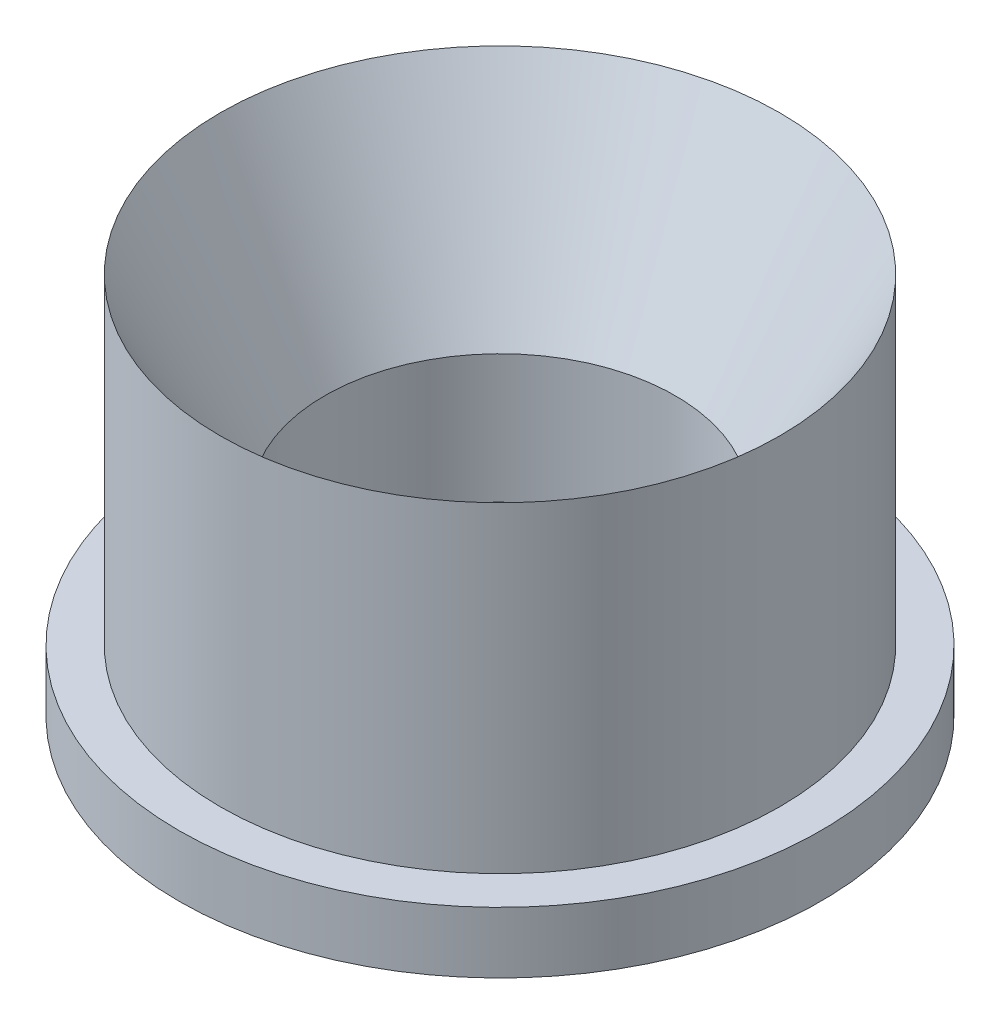
ISO-10303-21;
HEADER;
FILE_DESCRIPTION(('STEP AP214'),'2;1');
FILE_NAME('part.step','',(''),(''),'','','');
FILE_SCHEMA(('AUTOMOTIVE_DESIGN { 1 0 10303 214 1 1 1 1 }'));
ENDSEC;
DATA;
#1=APPLICATION_CONTEXT('core data for automotive mechanical design processes');
#2=APPLICATION_PROTOCOL_DEFINITION('international standard','automotive_design',2000,#1);
#3=PRODUCT_CONTEXT('',#1,'mechanical');
#4=PRODUCT('Part','Part','',(#3));
#5=PRODUCT_RELATED_PRODUCT_CATEGORY('part','',(#4));
#6=PRODUCT_DEFINITION_FORMATION('','',#4);
#7=PRODUCT_DEFINITION_CONTEXT('part definition',#1,'design');
#8=PRODUCT_DEFINITION('design','',#6,#7);
#9=PRODUCT_DEFINITION_SHAPE('','',#8);
#10=(LENGTH_UNIT() NAMED_UNIT(*) SI_UNIT(.MILLI.,.METRE.));
#11=(NAMED_UNIT(*) PLANE_ANGLE_UNIT() SI_UNIT($,.RADIAN.));
#12=(NAMED_UNIT(*) SI_UNIT($,.STERADIAN.) SOLID_ANGLE_UNIT());
#13=UNCERTAINTY_MEASURE_WITH_UNIT(LENGTH_MEASURE(1.E-05),#10,'distance_accuracy_value','');
#14=(GEOMETRIC_REPRESENTATION_CONTEXT(3) GLOBAL_UNCERTAINTY_ASSIGNED_CONTEXT((#13)) GLOBAL_UNIT_ASSIGNED_CONTEXT((#10,
#11,#12)) REPRESENTATION_CONTEXT('',''));
#15=CARTESIAN_POINT('',(0.,0.,0.));
#16=DIRECTION('',(0.,0.,1.));
#17=DIRECTION('',(1.,0.,0.));
#18=AXIS2_PLACEMENT_3D('',#15,#16,#17);
#19=CARTESIAN_POINT('',(0.,0.,0.));
#20=DIRECTION('',(0.,1.,0.));
#21=DIRECTION('',(0.,0.,1.));
#22=AXIS2_PLACEMENT_3D('',#19,#20,#21);
#23=PLANE('',#22);
#24=CARTESIAN_POINT('',(0.,0.,0.));
#25=DIRECTION('',(0.,1.,0.));
#26=DIRECTION('',(0.,0.,1.));
#27=AXIS2_PLACEMENT_3D('',#24,#25,#26);
#28=CIRCLE('',#27,29.1925);
#29=CARTESIAN_POINT('',(0.,0.,29.1925));
#30=VERTEX_POINT('',#29);
#31=EDGE_CURVE('E69',#30,#30,#28,.T.);
#32=ORIENTED_EDGE('',*,*,#31,.F.);
#33=EDGE_LOOP('',(#32));
#34=FACE_BOUND('',#33,.T.);
#35=CARTESIAN_POINT('',(0.,0.,0.));
#36=DIRECTION('',(0.,1.,0.));
#37=DIRECTION('',(0.,0.,1.));
#38=AXIS2_PLACEMENT_3D('',#35,#36,#37);
#39=CIRCLE('',#38,27.2875);
#40=CARTESIAN_POINT('',(0.,0.,27.2875));
#41=VERTEX_POINT('',#40);
#42=EDGE_CURVE('E10',#41,#41,#39,.T.);
#43=ORIENTED_EDGE('',*,*,#42,.T.);
#44=EDGE_LOOP('',(#43));
#45=FACE_BOUND('',#44,.T.);
#46=ADVANCED_FACE('F41',(#34,#45),#23,.F.);
#47=CARTESIAN_POINT('',(0.,52.97625,0.));
#48=DIRECTION('',(0.,1.,0.));
#49=DIRECTION('',(0.,0.,1.));
#50=AXIS2_PLACEMENT_3D('',#47,#48,#49);
#51=CYLINDRICAL_SURFACE('',#50,27.2875);
#52=CARTESIAN_POINT('',(0.,20.,0.));
#53=DIRECTION('',(0.,1.,0.));
#54=DIRECTION('',(0.,0.,1.));
#55=AXIS2_PLACEMENT_3D('',#52,#53,#54);
#56=CIRCLE('',#55,27.2875);
#57=CARTESIAN_POINT('',(0.,20.,27.2875));
#58=VERTEX_POINT('',#57);
#59=EDGE_CURVE('E47',#58,#58,#56,.T.);
#60=ORIENTED_EDGE('',*,*,#59,.T.);
#61=EDGE_LOOP('',(#60));
#62=FACE_BOUND('',#61,.T.);
#63=ORIENTED_EDGE('',*,*,#42,.F.);
#64=EDGE_LOOP('',(#63));
#65=FACE_BOUND('',#64,.T.);
#66=ADVANCED_FACE('F77',(#62,#65),#51,.F.);
#67=CARTESIAN_POINT('',(0.,20.,0.));
#68=DIRECTION('',(0.,1.,0.));
#69=DIRECTION('',(0.,0.,1.));
#70=AXIS2_PLACEMENT_3D('',#67,#68,#69);
#71=CONICAL_SURFACE('',#70,27.2875,0.49684789035443);
#72=CARTESIAN_POINT('',(0.,50.,0.));
#73=DIRECTION('',(0.,1.,0.));
#74=DIRECTION('',(0.,0.,1.));
#75=AXIS2_PLACEMENT_3D('',#72,#73,#74);
#76=CIRCLE('',#75,43.554);
#77=CARTESIAN_POINT('',(0.,50.,43.554));
#78=VERTEX_POINT('',#77);
#79=EDGE_CURVE('E51',#78,#78,#76,.T.);
#80=ORIENTED_EDGE('',*,*,#79,.T.);
#81=EDGE_LOOP('',(#80));
#82=FACE_BOUND('',#81,.T.);
#83=ORIENTED_EDGE('',*,*,#59,.F.);
#84=EDGE_LOOP('',(#83));
#85=FACE_BOUND('',#84,.T.);
#86=ADVANCED_FACE('F81',(#82,#85),#71,.F.);
#87=CARTESIAN_POINT('',(0.,52.97625,0.));
#88=DIRECTION('',(0.,1.,0.));
#89=DIRECTION('',(0.,0.,1.));
#90=AXIS2_PLACEMENT_3D('',#87,#88,#89);
#91=CYLINDRICAL_SURFACE('',#90,43.554);
#92=CARTESIAN_POINT('',(0.,0.,0.));
#93=DIRECTION('',(0.,1.,0.));
#94=DIRECTION('',(0.,0.,1.));
#95=AXIS2_PLACEMENT_3D('',#92,#93,#94);
#96=CIRCLE('',#95,43.554);
#97=CARTESIAN_POINT('',(0.,0.,43.554));
#98=VERTEX_POINT('',#97);
#99=EDGE_CURVE('E55',#98,#98,#96,.T.);
#100=ORIENTED_EDGE('',*,*,#99,.T.);
#101=EDGE_LOOP('',(#100));
#102=FACE_BOUND('',#101,.T.);
#103=ORIENTED_EDGE('',*,*,#79,.F.);
#104=EDGE_LOOP('',(#103));
#105=FACE_BOUND('',#104,.T.);
#106=ADVANCED_FACE('F85',(#102,#105),#91,.T.);
#107=CARTESIAN_POINT('',(0.,0.,0.));
#108=DIRECTION('',(0.,1.,0.));
#109=DIRECTION('',(0.,0.,1.));
#110=AXIS2_PLACEMENT_3D('',#107,#108,#109);
#111=PLANE('',#110);
#112=CARTESIAN_POINT('',(0.,0.,0.));
#113=DIRECTION('',(0.,1.,0.));
#114=DIRECTION('',(0.,0.,1.));
#115=AXIS2_PLACEMENT_3D('',#112,#113,#114);
#116=CIRCLE('',#115,49.9725264346517);
#117=CARTESIAN_POINT('',(0.,0.,49.9725264346517));
#118=VERTEX_POINT('',#117);
#119=EDGE_CURVE('E60',#118,#118,#116,.T.);
#120=ORIENTED_EDGE('',*,*,#119,.T.);
#121=EDGE_LOOP('',(#120));
#122=FACE_BOUND('',#121,.T.);
#123=ORIENTED_EDGE('',*,*,#99,.F.);
#124=EDGE_LOOP('',(#123));
#125=FACE_BOUND('',#124,.T.);
#126=ADVANCED_FACE('F92',(#122,#125),#111,.T.);
#127=CARTESIAN_POINT('',(0.,52.97625,0.));
#128=DIRECTION('',(0.,1.,0.));
#129=DIRECTION('',(0.,0.,1.));
#130=AXIS2_PLACEMENT_3D('',#127,#128,#129);
#131=CYLINDRICAL_SURFACE('',#130,49.9725264346517);
#132=CARTESIAN_POINT('',(0.,-9.525,0.));
#133=DIRECTION('',(0.,1.,0.));
#134=DIRECTION('',(0.,0.,1.));
#135=AXIS2_PLACEMENT_3D('',#132,#133,#134);
#136=CIRCLE('',#135,49.9725264346517);
#137=CARTESIAN_POINT('',(0.,-9.525,49.9725264346517));
#138=VERTEX_POINT('',#137);
#139=EDGE_CURVE('E63',#138,#138,#136,.T.);
#140=ORIENTED_EDGE('',*,*,#139,.T.);
#141=EDGE_LOOP('',(#140));
#142=FACE_BOUND('',#141,.T.);
#143=ORIENTED_EDGE('',*,*,#119,.F.);
#144=EDGE_LOOP('',(#143));
#145=FACE_BOUND('',#144,.T.);
#146=ADVANCED_FACE('F96',(#142,#145),#131,.T.);
#147=CARTESIAN_POINT('',(0.,-9.525,0.));
#148=DIRECTION('',(0.,-1.,0.));
#149=DIRECTION('',(0.,0.,-1.));
#150=AXIS2_PLACEMENT_3D('',#147,#148,#149);
#151=PLANE('',#150);
#152=CARTESIAN_POINT('',(0.,-9.525,0.));
#153=DIRECTION('',(0.,1.,0.));
#154=DIRECTION('',(0.,0.,1.));
#155=AXIS2_PLACEMENT_3D('',#152,#153,#154);
#156=CIRCLE('',#155,29.1925);
#157=CARTESIAN_POINT('',(0.,-9.525,29.1925));
#158=VERTEX_POINT('',#157);
#159=EDGE_CURVE('E66',#158,#158,#156,.T.);
#160=ORIENTED_EDGE('',*,*,#159,.T.);
#161=EDGE_LOOP('',(#160));
#162=FACE_BOUND('',#161,.T.);
#163=ORIENTED_EDGE('',*,*,#139,.F.);
#164=EDGE_LOOP('',(#163));
#165=FACE_BOUND('',#164,.T.);
#166=ADVANCED_FACE('F100',(#162,#165),#151,.T.);
#167=CARTESIAN_POINT('',(0.,52.97625,0.));
#168=DIRECTION('',(0.,1.,0.));
#169=DIRECTION('',(0.,0.,1.));
#170=AXIS2_PLACEMENT_3D('',#167,#168,#169);
#171=CYLINDRICAL_SURFACE('',#170,29.1925);
#172=ORIENTED_EDGE('',*,*,#31,.T.);
#173=EDGE_LOOP('',(#172));
#174=FACE_BOUND('',#173,.T.);
#175=ORIENTED_EDGE('',*,*,#159,.F.);
#176=EDGE_LOOP('',(#175));
#177=FACE_BOUND('',#176,.T.);
#178=ADVANCED_FACE('F73',(#174,#177),#171,.F.);
#179=CLOSED_SHELL('',(#46,#66,#86,#106,#126,#146,#166,#178));
#180=MANIFOLD_SOLID_BREP('B2',#179);
#181=ADVANCED_BREP_SHAPE_REPRESENTATION('',(#18,#180),#14);
#182=SHAPE_DEFINITION_REPRESENTATION(#9,#181);
ENDSEC;
END-ISO-10303-21;
